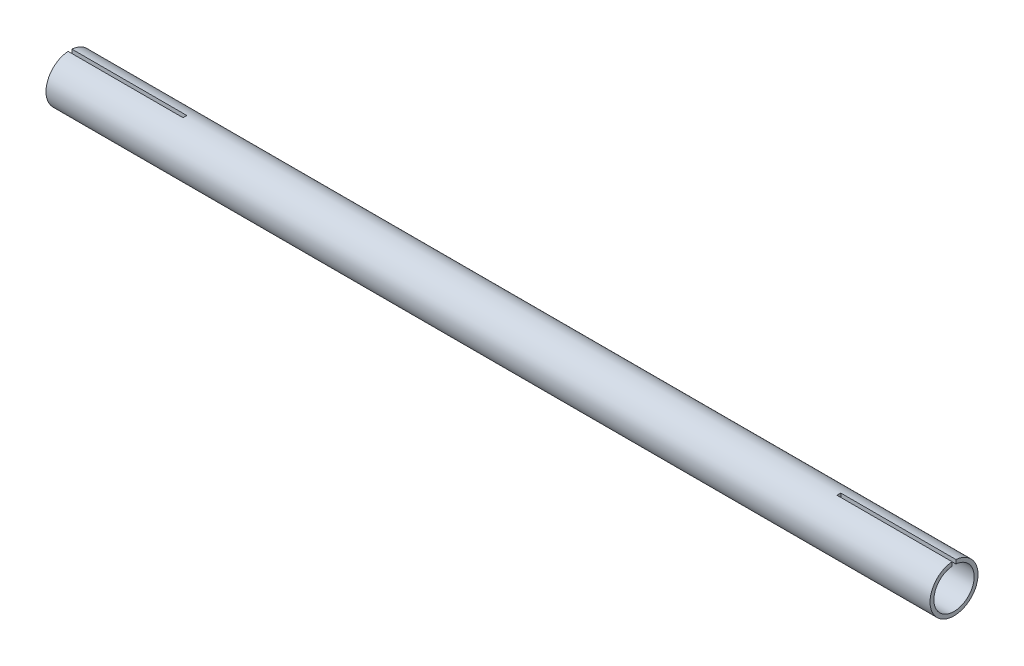
ISO-10303-21;
HEADER;
FILE_DESCRIPTION(('STEP AP214'),'2;1');
FILE_NAME('part.step','',(''),(''),'','','');
FILE_SCHEMA(('AUTOMOTIVE_DESIGN { 1 0 10303 214 1 1 1 1 }'));
ENDSEC;
DATA;
#1=APPLICATION_CONTEXT('core data for automotive mechanical design processes');
#2=APPLICATION_PROTOCOL_DEFINITION('international standard','automotive_design',2000,#1);
#3=PRODUCT_CONTEXT('',#1,'mechanical');
#4=PRODUCT('Part','Part','',(#3));
#5=PRODUCT_RELATED_PRODUCT_CATEGORY('part','',(#4));
#6=PRODUCT_DEFINITION_FORMATION('','',#4);
#7=PRODUCT_DEFINITION_CONTEXT('part definition',#1,'design');
#8=PRODUCT_DEFINITION('design','',#6,#7);
#9=PRODUCT_DEFINITION_SHAPE('','',#8);
#10=(LENGTH_UNIT() NAMED_UNIT(*) SI_UNIT(.MILLI.,.METRE.));
#11=(NAMED_UNIT(*) PLANE_ANGLE_UNIT() SI_UNIT($,.RADIAN.));
#12=(NAMED_UNIT(*) SI_UNIT($,.STERADIAN.) SOLID_ANGLE_UNIT());
#13=UNCERTAINTY_MEASURE_WITH_UNIT(LENGTH_MEASURE(1.E-05),#10,'distance_accuracy_value','');
#14=(GEOMETRIC_REPRESENTATION_CONTEXT(3) GLOBAL_UNCERTAINTY_ASSIGNED_CONTEXT((#13)) GLOBAL_UNIT_ASSIGNED_CONTEXT((#10,
#11,#12)) REPRESENTATION_CONTEXT('',''));
#15=CARTESIAN_POINT('',(0.,0.,0.));
#16=DIRECTION('',(0.,0.,1.));
#17=DIRECTION('',(1.,0.,0.));
#18=AXIS2_PLACEMENT_3D('',#15,#16,#17);
#19=CARTESIAN_POINT('',(-230.5,0.,0.));
#20=DIRECTION('',(1.,0.,0.));
#21=DIRECTION('',(0.,0.,-1.));
#22=AXIS2_PLACEMENT_3D('',#19,#20,#21);
#23=PLANE('',#22);
#24=DIRECTION('',(0.,-1.,0.));
#25=VECTOR('',#24,1.);
#26=CARTESIAN_POINT('',(-230.5,15.,1.));
#27=LINE('',#26,#25);
#28=CARTESIAN_POINT('',(-230.5,12.4599357943771,1.));
#29=VERTEX_POINT('',#28);
#30=CARTESIAN_POINT('',(-230.5,10.4522724801834,0.999999999999999));
#31=VERTEX_POINT('',#30);
#32=EDGE_CURVE('E96',#29,#31,#27,.T.);
#33=ORIENTED_EDGE('',*,*,#32,.T.);
#34=CARTESIAN_POINT('',(-230.5,0.,0.));
#35=DIRECTION('',(1.,0.,0.));
#36=DIRECTION('',(0.,0.,-1.));
#37=AXIS2_PLACEMENT_3D('',#34,#35,#36);
#38=CIRCLE('',#37,10.5);
#39=CARTESIAN_POINT('',(-230.5,10.4522724801834,-1.));
#40=VERTEX_POINT('',#39);
#41=EDGE_CURVE('E125',#31,#40,#38,.T.);
#42=ORIENTED_EDGE('',*,*,#41,.T.);
#43=DIRECTION('',(0.,1.,0.));
#44=VECTOR('',#43,1.);
#45=CARTESIAN_POINT('',(-230.5,15.,-1.));
#46=LINE('',#45,#44);
#47=CARTESIAN_POINT('',(-230.5,12.4599357943771,-1.));
#48=VERTEX_POINT('',#47);
#49=EDGE_CURVE('E106',#40,#48,#46,.T.);
#50=ORIENTED_EDGE('',*,*,#49,.T.);
#51=CARTESIAN_POINT('',(-230.5,0.,0.));
#52=DIRECTION('',(1.,0.,0.));
#53=DIRECTION('',(0.,0.,-1.));
#54=AXIS2_PLACEMENT_3D('',#51,#52,#53);
#55=CIRCLE('',#54,12.5);
#56=EDGE_CURVE('E112',#29,#48,#55,.T.);
#57=ORIENTED_EDGE('',*,*,#56,.F.);
#58=EDGE_LOOP('',(#33,#42,#50,#57));
#59=FACE_BOUND('',#58,.T.);
#60=ADVANCED_FACE('F32',(#59),#23,.F.);
#61=CARTESIAN_POINT('',(230.5,0.,0.));
#62=DIRECTION('',(-1.,0.,0.));
#63=DIRECTION('',(0.,0.,1.));
#64=AXIS2_PLACEMENT_3D('',#61,#62,#63);
#65=CYLINDRICAL_SURFACE('',#64,12.5);
#66=CARTESIAN_POINT('',(230.5,0.,0.));
#67=DIRECTION('',(1.,0.,0.));
#68=DIRECTION('',(0.,0.,-1.));
#69=AXIS2_PLACEMENT_3D('',#66,#67,#68);
#70=CIRCLE('',#69,12.5);
#71=CARTESIAN_POINT('',(230.5,12.4599357943771,1.));
#72=VERTEX_POINT('',#71);
#73=CARTESIAN_POINT('',(230.5,12.4599357943771,-1.));
#74=VERTEX_POINT('',#73);
#75=EDGE_CURVE('E118',#72,#74,#70,.T.);
#76=ORIENTED_EDGE('',*,*,#75,.F.);
#77=DIRECTION('',(-1.,0.,0.));
#78=VECTOR('',#77,1.);
#79=CARTESIAN_POINT('',(230.5,12.4599357943771,1.));
#80=LINE('',#79,#78);
#81=CARTESIAN_POINT('',(170.5,12.4599357943771,1.));
#82=VERTEX_POINT('',#81);
#83=EDGE_CURVE('E140',#72,#82,#80,.T.);
#84=ORIENTED_EDGE('',*,*,#83,.T.);
#85=CARTESIAN_POINT('',(170.5,0.,0.));
#86=DIRECTION('',(-1.,0.,0.));
#87=DIRECTION('',(0.,0.,1.));
#88=AXIS2_PLACEMENT_3D('',#85,#86,#87);
#89=CIRCLE('',#88,12.5);
#90=CARTESIAN_POINT('',(170.5,12.4599357943771,-1.));
#91=VERTEX_POINT('',#90);
#92=EDGE_CURVE('E147',#82,#91,#89,.T.);
#93=ORIENTED_EDGE('',*,*,#92,.T.);
#94=DIRECTION('',(-1.,0.,0.));
#95=VECTOR('',#94,1.);
#96=CARTESIAN_POINT('',(230.5,12.4599357943771,-1.));
#97=LINE('',#96,#95);
#98=EDGE_CURVE('E142',#91,#74,#97,.F.);
#99=ORIENTED_EDGE('',*,*,#98,.T.);
#100=EDGE_LOOP('',(#76,#84,#93,#99));
#101=FACE_BOUND('',#100,.T.);
#102=DIRECTION('',(-1.,0.,0.));
#103=VECTOR('',#102,1.);
#104=CARTESIAN_POINT('',(230.5,12.4599357943771,1.));
#105=LINE('',#104,#103);
#106=CARTESIAN_POINT('',(-170.5,12.4599357943771,1.));
#107=VERTEX_POINT('',#106);
#108=EDGE_CURVE('E100',#29,#107,#105,.F.);
#109=ORIENTED_EDGE('',*,*,#108,.F.);
#110=ORIENTED_EDGE('',*,*,#56,.T.);
#111=DIRECTION('',(-1.,0.,0.));
#112=VECTOR('',#111,1.);
#113=CARTESIAN_POINT('',(230.5,12.4599357943771,-1.));
#114=LINE('',#113,#112);
#115=CARTESIAN_POINT('',(-170.5,12.4599357943771,-1.));
#116=VERTEX_POINT('',#115);
#117=EDGE_CURVE('E115',#116,#48,#114,.T.);
#118=ORIENTED_EDGE('',*,*,#117,.F.);
#119=CARTESIAN_POINT('',(-170.5,0.,0.));
#120=DIRECTION('',(1.,0.,0.));
#121=DIRECTION('',(0.,0.,-1.));
#122=AXIS2_PLACEMENT_3D('',#119,#120,#121);
#123=CIRCLE('',#122,12.5);
#124=EDGE_CURVE('E113',#116,#107,#123,.T.);
#125=ORIENTED_EDGE('',*,*,#124,.T.);
#126=EDGE_LOOP('',(#109,#110,#118,#125));
#127=FACE_BOUND('',#126,.T.);
#128=ADVANCED_FACE('F34',(#101,#127),#65,.T.);
#129=CARTESIAN_POINT('',(230.5,0.,0.));
#130=DIRECTION('',(-1.,0.,0.));
#131=DIRECTION('',(0.,0.,1.));
#132=AXIS2_PLACEMENT_3D('',#129,#130,#131);
#133=CYLINDRICAL_SURFACE('',#132,10.5);
#134=DIRECTION('',(-1.,0.,0.));
#135=VECTOR('',#134,1.);
#136=CARTESIAN_POINT('',(230.5,10.4522724801834,0.999999999999999));
#137=LINE('',#136,#135);
#138=CARTESIAN_POINT('',(230.5,10.4522724801834,0.999999999999999));
#139=VERTEX_POINT('',#138);
#140=CARTESIAN_POINT('',(170.5,10.4522724801834,0.999999999999999));
#141=VERTEX_POINT('',#140);
#142=EDGE_CURVE('E132',#139,#141,#137,.T.);
#143=ORIENTED_EDGE('',*,*,#142,.F.);
#144=CARTESIAN_POINT('',(230.5,0.,0.));
#145=DIRECTION('',(1.,0.,0.));
#146=DIRECTION('',(0.,0.,-1.));
#147=AXIS2_PLACEMENT_3D('',#144,#145,#146);
#148=CIRCLE('',#147,10.5);
#149=CARTESIAN_POINT('',(230.5,10.4522724801834,-1.));
#150=VERTEX_POINT('',#149);
#151=EDGE_CURVE('E119',#139,#150,#148,.T.);
#152=ORIENTED_EDGE('',*,*,#151,.T.);
#153=DIRECTION('',(-1.,0.,0.));
#154=VECTOR('',#153,1.);
#155=CARTESIAN_POINT('',(230.5,10.4522724801834,-1.));
#156=LINE('',#155,#154);
#157=CARTESIAN_POINT('',(170.5,10.4522724801834,-1.));
#158=VERTEX_POINT('',#157);
#159=EDGE_CURVE('E130',#158,#150,#156,.F.);
#160=ORIENTED_EDGE('',*,*,#159,.F.);
#161=CARTESIAN_POINT('',(170.5,0.,0.));
#162=DIRECTION('',(-1.,0.,0.));
#163=DIRECTION('',(0.,0.,1.));
#164=AXIS2_PLACEMENT_3D('',#161,#162,#163);
#165=CIRCLE('',#164,10.5);
#166=EDGE_CURVE('E122',#141,#158,#165,.T.);
#167=ORIENTED_EDGE('',*,*,#166,.F.);
#168=EDGE_LOOP('',(#143,#152,#160,#167));
#169=FACE_BOUND('',#168,.T.);
#170=ORIENTED_EDGE('',*,*,#41,.F.);
#171=DIRECTION('',(-1.,0.,0.));
#172=VECTOR('',#171,1.);
#173=CARTESIAN_POINT('',(230.5,10.4522724801834,0.999999999999999));
#174=LINE('',#173,#172);
#175=CARTESIAN_POINT('',(-170.5,10.4522724801834,0.999999999999999));
#176=VERTEX_POINT('',#175);
#177=EDGE_CURVE('E11',#31,#176,#174,.F.);
#178=ORIENTED_EDGE('',*,*,#177,.T.);
#179=CARTESIAN_POINT('',(-170.5,0.,0.));
#180=DIRECTION('',(1.,0.,0.));
#181=DIRECTION('',(0.,0.,-1.));
#182=AXIS2_PLACEMENT_3D('',#179,#180,#181);
#183=CIRCLE('',#182,10.5);
#184=CARTESIAN_POINT('',(-170.5,10.4522724801834,-1.));
#185=VERTEX_POINT('',#184);
#186=EDGE_CURVE('E134',#185,#176,#183,.T.);
#187=ORIENTED_EDGE('',*,*,#186,.F.);
#188=DIRECTION('',(-1.,0.,0.));
#189=VECTOR('',#188,1.);
#190=CARTESIAN_POINT('',(230.5,10.4522724801834,-1.));
#191=LINE('',#190,#189);
#192=EDGE_CURVE('E40',#185,#40,#191,.T.);
#193=ORIENTED_EDGE('',*,*,#192,.T.);
#194=EDGE_LOOP('',(#170,#178,#187,#193));
#195=FACE_BOUND('',#194,.T.);
#196=ADVANCED_FACE('F138',(#169,#195),#133,.F.);
#197=CARTESIAN_POINT('',(230.5,0.,0.));
#198=DIRECTION('',(1.,0.,0.));
#199=DIRECTION('',(0.,0.,-1.));
#200=AXIS2_PLACEMENT_3D('',#197,#198,#199);
#201=PLANE('',#200);
#202=DIRECTION('',(0.,-1.,0.));
#203=VECTOR('',#202,1.);
#204=CARTESIAN_POINT('',(230.5,15.,1.));
#205=LINE('',#204,#203);
#206=EDGE_CURVE('E114',#72,#139,#205,.T.);
#207=ORIENTED_EDGE('',*,*,#206,.F.);
#208=ORIENTED_EDGE('',*,*,#75,.T.);
#209=DIRECTION('',(0.,1.,0.));
#210=VECTOR('',#209,1.);
#211=CARTESIAN_POINT('',(230.5,15.,-1.));
#212=LINE('',#211,#210);
#213=EDGE_CURVE('E151',#150,#74,#212,.T.);
#214=ORIENTED_EDGE('',*,*,#213,.F.);
#215=ORIENTED_EDGE('',*,*,#151,.F.);
#216=EDGE_LOOP('',(#207,#208,#214,#215));
#217=FACE_BOUND('',#216,.T.);
#218=ADVANCED_FACE('F179',(#217),#201,.T.);
#219=CARTESIAN_POINT('',(170.5,15.,1.));
#220=DIRECTION('',(0.,0.,1.));
#221=DIRECTION('',(0.,-1.,0.));
#222=AXIS2_PLACEMENT_3D('',#219,#220,#221);
#223=PLANE('',#222);
#224=ORIENTED_EDGE('',*,*,#206,.T.);
#225=ORIENTED_EDGE('',*,*,#142,.T.);
#226=DIRECTION('',(0.,-1.,0.));
#227=VECTOR('',#226,1.);
#228=CARTESIAN_POINT('',(170.5,15.,1.));
#229=LINE('',#228,#227);
#230=EDGE_CURVE('E55',#82,#141,#229,.T.);
#231=ORIENTED_EDGE('',*,*,#230,.F.);
#232=ORIENTED_EDGE('',*,*,#83,.F.);
#233=EDGE_LOOP('',(#224,#225,#231,#232));
#234=FACE_BOUND('',#233,.T.);
#235=ADVANCED_FACE('F182',(#234),#223,.F.);
#236=CARTESIAN_POINT('',(170.5,15.,-1.));
#237=DIRECTION('',(0.,0.,-1.));
#238=DIRECTION('',(0.,1.,0.));
#239=AXIS2_PLACEMENT_3D('',#236,#237,#238);
#240=PLANE('',#239);
#241=DIRECTION('',(0.,1.,0.));
#242=VECTOR('',#241,1.);
#243=CARTESIAN_POINT('',(170.5,15.,-1.));
#244=LINE('',#243,#242);
#245=EDGE_CURVE('E150',#158,#91,#244,.T.);
#246=ORIENTED_EDGE('',*,*,#245,.F.);
#247=ORIENTED_EDGE('',*,*,#159,.T.);
#248=ORIENTED_EDGE('',*,*,#213,.T.);
#249=ORIENTED_EDGE('',*,*,#98,.F.);
#250=EDGE_LOOP('',(#246,#247,#248,#249));
#251=FACE_BOUND('',#250,.T.);
#252=ADVANCED_FACE('F189',(#251),#240,.F.);
#253=CARTESIAN_POINT('',(170.5,0.,0.));
#254=DIRECTION('',(-1.,0.,0.));
#255=DIRECTION('',(0.,0.,1.));
#256=AXIS2_PLACEMENT_3D('',#253,#254,#255);
#257=PLANE('',#256);
#258=ORIENTED_EDGE('',*,*,#230,.T.);
#259=ORIENTED_EDGE('',*,*,#166,.T.);
#260=ORIENTED_EDGE('',*,*,#245,.T.);
#261=ORIENTED_EDGE('',*,*,#92,.F.);
#262=EDGE_LOOP('',(#258,#259,#260,#261));
#263=FACE_BOUND('',#262,.T.);
#264=ADVANCED_FACE('F171',(#263),#257,.F.);
#265=CARTESIAN_POINT('',(-170.5,15.,1.));
#266=DIRECTION('',(0.,0.,-1.));
#267=DIRECTION('',(0.,1.,0.));
#268=AXIS2_PLACEMENT_3D('',#265,#266,#267);
#269=PLANE('',#268);
#270=ORIENTED_EDGE('',*,*,#108,.T.);
#271=DIRECTION('',(0.,-1.,0.));
#272=VECTOR('',#271,1.);
#273=CARTESIAN_POINT('',(-170.5,15.,1.));
#274=LINE('',#273,#272);
#275=EDGE_CURVE('E159',#107,#176,#274,.T.);
#276=ORIENTED_EDGE('',*,*,#275,.T.);
#277=ORIENTED_EDGE('',*,*,#177,.F.);
#278=ORIENTED_EDGE('',*,*,#32,.F.);
#279=EDGE_LOOP('',(#270,#276,#277,#278));
#280=FACE_BOUND('',#279,.T.);
#281=ADVANCED_FACE('F98',(#280),#269,.T.);
#282=CARTESIAN_POINT('',(-170.5,15.,-1.));
#283=DIRECTION('',(0.,0.,1.));
#284=DIRECTION('',(0.,-1.,0.));
#285=AXIS2_PLACEMENT_3D('',#282,#283,#284);
#286=PLANE('',#285);
#287=ORIENTED_EDGE('',*,*,#117,.T.);
#288=ORIENTED_EDGE('',*,*,#49,.F.);
#289=ORIENTED_EDGE('',*,*,#192,.F.);
#290=DIRECTION('',(0.,1.,0.));
#291=VECTOR('',#290,1.);
#292=CARTESIAN_POINT('',(-170.5,15.,-1.));
#293=LINE('',#292,#291);
#294=EDGE_CURVE('E47',#185,#116,#293,.T.);
#295=ORIENTED_EDGE('',*,*,#294,.T.);
#296=EDGE_LOOP('',(#287,#288,#289,#295));
#297=FACE_BOUND('',#296,.T.);
#298=ADVANCED_FACE('F163',(#297),#286,.T.);
#299=CARTESIAN_POINT('',(-170.5,0.,0.));
#300=DIRECTION('',(1.,0.,0.));
#301=DIRECTION('',(0.,0.,1.));
#302=AXIS2_PLACEMENT_3D('',#299,#300,#301);
#303=PLANE('',#302);
#304=ORIENTED_EDGE('',*,*,#294,.F.);
#305=ORIENTED_EDGE('',*,*,#186,.T.);
#306=ORIENTED_EDGE('',*,*,#275,.F.);
#307=ORIENTED_EDGE('',*,*,#124,.F.);
#308=EDGE_LOOP('',(#304,#305,#306,#307));
#309=FACE_BOUND('',#308,.T.);
#310=ADVANCED_FACE('F162',(#309),#303,.F.);
#311=CLOSED_SHELL('',(#60,#128,#196,#218,#235,#252,#264,#281,#298,#310));
#312=MANIFOLD_SOLID_BREP('B2',#311);
#313=ADVANCED_BREP_SHAPE_REPRESENTATION('',(#18,#312),#14);
#314=SHAPE_DEFINITION_REPRESENTATION(#9,#313);
ENDSEC;
END-ISO-10303-21;
